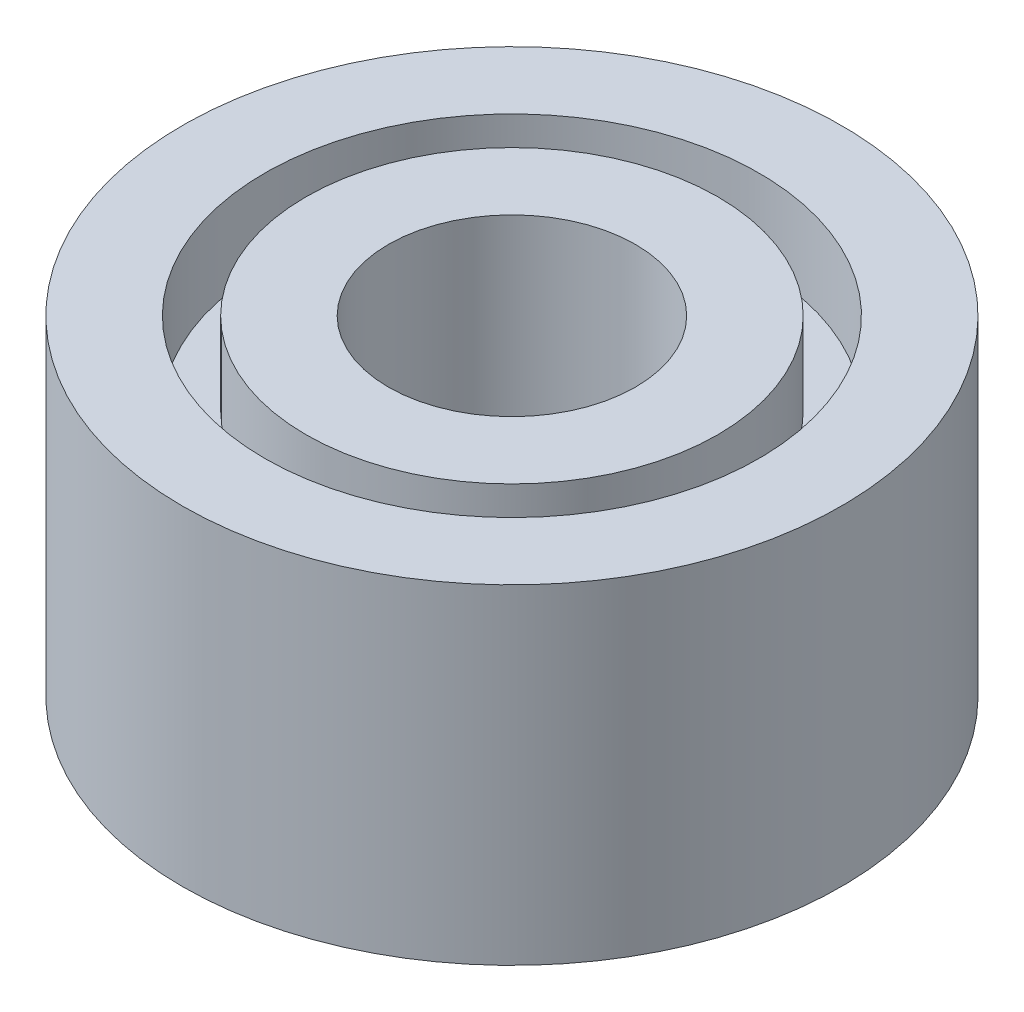
ISO-10303-21;
HEADER;
FILE_DESCRIPTION(('STEP AP214'),'2;1');
FILE_NAME('part.step','',(''),(''),'','','');
FILE_SCHEMA(('AUTOMOTIVE_DESIGN { 1 0 10303 214 1 1 1 1 }'));
ENDSEC;
DATA;
#1=APPLICATION_CONTEXT('core data for automotive mechanical design processes');
#2=APPLICATION_PROTOCOL_DEFINITION('international standard','automotive_design',2000,#1);
#3=PRODUCT_CONTEXT('',#1,'mechanical');
#4=PRODUCT('Part','Part','',(#3));
#5=PRODUCT_RELATED_PRODUCT_CATEGORY('part','',(#4));
#6=PRODUCT_DEFINITION_FORMATION('','',#4);
#7=PRODUCT_DEFINITION_CONTEXT('part definition',#1,'design');
#8=PRODUCT_DEFINITION('design','',#6,#7);
#9=PRODUCT_DEFINITION_SHAPE('','',#8);
#10=(LENGTH_UNIT() NAMED_UNIT(*) SI_UNIT(.MILLI.,.METRE.));
#11=(NAMED_UNIT(*) PLANE_ANGLE_UNIT() SI_UNIT($,.RADIAN.));
#12=(NAMED_UNIT(*) SI_UNIT($,.STERADIAN.) SOLID_ANGLE_UNIT());
#13=UNCERTAINTY_MEASURE_WITH_UNIT(LENGTH_MEASURE(1.E-05),#10,'distance_accuracy_value','');
#14=(GEOMETRIC_REPRESENTATION_CONTEXT(3) GLOBAL_UNCERTAINTY_ASSIGNED_CONTEXT((#13)) GLOBAL_UNIT_ASSIGNED_CONTEXT((#10,
#11,#12)) REPRESENTATION_CONTEXT('',''));
#15=CARTESIAN_POINT('',(0.,0.,0.));
#16=DIRECTION('',(0.,0.,1.));
#17=DIRECTION('',(1.,0.,0.));
#18=AXIS2_PLACEMENT_3D('',#15,#16,#17);
#19=CARTESIAN_POINT('',(0.,0.,0.));
#20=DIRECTION('',(0.,1.,0.));
#21=DIRECTION('',(0.,0.,1.));
#22=AXIS2_PLACEMENT_3D('',#19,#20,#21);
#23=PLANE('',#22);
#24=CARTESIAN_POINT('',(0.,0.,0.));
#25=DIRECTION('',(0.,1.,0.));
#26=DIRECTION('',(0.,0.,1.));
#27=AXIS2_PLACEMENT_3D('',#24,#25,#26);
#28=CIRCLE('',#27,1.5);
#29=CARTESIAN_POINT('',(0.,0.,1.5));
#30=VERTEX_POINT('',#29);
#31=EDGE_CURVE('E46',#30,#30,#28,.T.);
#32=ORIENTED_EDGE('',*,*,#31,.T.);
#33=EDGE_LOOP('',(#32));
#34=FACE_BOUND('',#33,.T.);
#35=CARTESIAN_POINT('',(0.,0.,0.));
#36=DIRECTION('',(0.,1.,0.));
#37=DIRECTION('',(0.,0.,1.));
#38=AXIS2_PLACEMENT_3D('',#35,#36,#37);
#39=CIRCLE('',#38,2.5);
#40=CARTESIAN_POINT('',(0.,0.,2.5));
#41=VERTEX_POINT('',#40);
#42=EDGE_CURVE('E70',#41,#41,#39,.T.);
#43=ORIENTED_EDGE('',*,*,#42,.F.);
#44=EDGE_LOOP('',(#43));
#45=FACE_BOUND('',#44,.T.);
#46=ADVANCED_FACE('F33',(#34,#45),#23,.F.);
#47=CARTESIAN_POINT('',(0.,4.,0.));
#48=DIRECTION('',(0.,1.,0.));
#49=DIRECTION('',(0.,0.,1.));
#50=AXIS2_PLACEMENT_3D('',#47,#48,#49);
#51=PLANE('',#50);
#52=CARTESIAN_POINT('',(0.,4.,0.));
#53=DIRECTION('',(0.,1.,0.));
#54=DIRECTION('',(0.,0.,1.));
#55=AXIS2_PLACEMENT_3D('',#52,#53,#54);
#56=CIRCLE('',#55,1.5);
#57=CARTESIAN_POINT('',(0.,4.,1.5));
#58=VERTEX_POINT('',#57);
#59=EDGE_CURVE('E44',#58,#58,#56,.T.);
#60=ORIENTED_EDGE('',*,*,#59,.F.);
#61=EDGE_LOOP('',(#60));
#62=FACE_BOUND('',#61,.T.);
#63=CARTESIAN_POINT('',(0.,4.,0.));
#64=DIRECTION('',(0.,1.,0.));
#65=DIRECTION('',(0.,0.,1.));
#66=AXIS2_PLACEMENT_3D('',#63,#64,#65);
#67=CIRCLE('',#66,2.5);
#68=CARTESIAN_POINT('',(0.,4.,2.5));
#69=VERTEX_POINT('',#68);
#70=EDGE_CURVE('E58',#69,#69,#67,.T.);
#71=ORIENTED_EDGE('',*,*,#70,.T.);
#72=EDGE_LOOP('',(#71));
#73=FACE_BOUND('',#72,.T.);
#74=ADVANCED_FACE('F86',(#62,#73),#51,.T.);
#75=CARTESIAN_POINT('',(0.,4.,0.));
#76=DIRECTION('',(0.,1.,0.));
#77=DIRECTION('',(0.,0.,1.));
#78=AXIS2_PLACEMENT_3D('',#75,#76,#77);
#79=CIRCLE('',#78,3.);
#80=CARTESIAN_POINT('',(0.,4.,3.));
#81=VERTEX_POINT('',#80);
#82=EDGE_CURVE('E52',#81,#81,#79,.T.);
#83=ORIENTED_EDGE('',*,*,#82,.F.);
#84=EDGE_LOOP('',(#83));
#85=FACE_BOUND('',#84,.T.);
#86=CARTESIAN_POINT('',(0.,4.,0.));
#87=DIRECTION('',(0.,1.,0.));
#88=DIRECTION('',(0.,0.,1.));
#89=AXIS2_PLACEMENT_3D('',#86,#87,#88);
#90=CIRCLE('',#89,4.);
#91=CARTESIAN_POINT('',(0.,4.,4.));
#92=VERTEX_POINT('',#91);
#93=EDGE_CURVE('E10',#92,#92,#90,.T.);
#94=ORIENTED_EDGE('',*,*,#93,.T.);
#95=EDGE_LOOP('',(#94));
#96=FACE_BOUND('',#95,.T.);
#97=ADVANCED_FACE('F92',(#85,#96),#51,.T.);
#98=CARTESIAN_POINT('',(0.,0.,0.));
#99=DIRECTION('',(0.,1.,0.));
#100=DIRECTION('',(0.,0.,1.));
#101=AXIS2_PLACEMENT_3D('',#98,#99,#100);
#102=CIRCLE('',#101,3.);
#103=CARTESIAN_POINT('',(0.,0.,3.));
#104=VERTEX_POINT('',#103);
#105=EDGE_CURVE('E64',#104,#104,#102,.T.);
#106=ORIENTED_EDGE('',*,*,#105,.T.);
#107=EDGE_LOOP('',(#106));
#108=FACE_BOUND('',#107,.T.);
#109=CARTESIAN_POINT('',(0.,0.,0.));
#110=DIRECTION('',(0.,1.,0.));
#111=DIRECTION('',(0.,0.,1.));
#112=AXIS2_PLACEMENT_3D('',#109,#110,#111);
#113=CIRCLE('',#112,4.);
#114=CARTESIAN_POINT('',(0.,0.,4.));
#115=VERTEX_POINT('',#114);
#116=EDGE_CURVE('E37',#115,#115,#113,.T.);
#117=ORIENTED_EDGE('',*,*,#116,.F.);
#118=EDGE_LOOP('',(#117));
#119=FACE_BOUND('',#118,.T.);
#120=ADVANCED_FACE('F88',(#108,#119),#23,.F.);
#121=CARTESIAN_POINT('',(0.,4.,0.));
#122=DIRECTION('',(0.,-1.,0.));
#123=DIRECTION('',(0.,0.,-1.));
#124=AXIS2_PLACEMENT_3D('',#121,#122,#123);
#125=CYLINDRICAL_SURFACE('',#124,4.);
#126=ORIENTED_EDGE('',*,*,#93,.F.);
#127=EDGE_LOOP('',(#126));
#128=FACE_BOUND('',#127,.T.);
#129=ORIENTED_EDGE('',*,*,#116,.T.);
#130=EDGE_LOOP('',(#129));
#131=FACE_BOUND('',#130,.T.);
#132=ADVANCED_FACE('F35',(#128,#131),#125,.T.);
#133=CARTESIAN_POINT('',(0.,4.,0.));
#134=DIRECTION('',(0.,-1.,0.));
#135=DIRECTION('',(0.,0.,-1.));
#136=AXIS2_PLACEMENT_3D('',#133,#134,#135);
#137=CYLINDRICAL_SURFACE('',#136,1.5);
#138=ORIENTED_EDGE('',*,*,#59,.T.);
#139=EDGE_LOOP('',(#138));
#140=FACE_BOUND('',#139,.T.);
#141=ORIENTED_EDGE('',*,*,#31,.F.);
#142=EDGE_LOOP('',(#141));
#143=FACE_BOUND('',#142,.T.);
#144=ADVANCED_FACE('F101',(#140,#143),#137,.F.);
#145=CARTESIAN_POINT('',(0.,3.,0.));
#146=DIRECTION('',(0.,1.,0.));
#147=DIRECTION('',(0.,0.,1.));
#148=AXIS2_PLACEMENT_3D('',#145,#146,#147);
#149=CYLINDRICAL_SURFACE('',#148,3.);
#150=CARTESIAN_POINT('',(0.,3.,0.));
#151=DIRECTION('',(0.,1.,0.));
#152=DIRECTION('',(0.,0.,1.));
#153=AXIS2_PLACEMENT_3D('',#150,#151,#152);
#154=CIRCLE('',#153,3.);
#155=CARTESIAN_POINT('',(0.,3.,3.));
#156=VERTEX_POINT('',#155);
#157=EDGE_CURVE('E49',#156,#156,#154,.T.);
#158=ORIENTED_EDGE('',*,*,#157,.F.);
#159=EDGE_LOOP('',(#158));
#160=FACE_BOUND('',#159,.T.);
#161=ORIENTED_EDGE('',*,*,#82,.T.);
#162=EDGE_LOOP('',(#161));
#163=FACE_BOUND('',#162,.T.);
#164=ADVANCED_FACE('F125',(#160,#163),#149,.F.);
#165=CARTESIAN_POINT('',(0.,3.,0.));
#166=DIRECTION('',(0.,1.,0.));
#167=DIRECTION('',(0.,0.,1.));
#168=AXIS2_PLACEMENT_3D('',#165,#166,#167);
#169=PLANE('',#168);
#170=CARTESIAN_POINT('',(0.,3.,0.));
#171=DIRECTION('',(0.,1.,0.));
#172=DIRECTION('',(0.,0.,1.));
#173=AXIS2_PLACEMENT_3D('',#170,#171,#172);
#174=CIRCLE('',#173,2.5);
#175=CARTESIAN_POINT('',(0.,3.,2.5));
#176=VERTEX_POINT('',#175);
#177=EDGE_CURVE('E55',#176,#176,#174,.T.);
#178=ORIENTED_EDGE('',*,*,#177,.F.);
#179=EDGE_LOOP('',(#178));
#180=FACE_BOUND('',#179,.T.);
#181=ORIENTED_EDGE('',*,*,#157,.T.);
#182=EDGE_LOOP('',(#181));
#183=FACE_BOUND('',#182,.T.);
#184=ADVANCED_FACE('F121',(#180,#183),#169,.T.);
#185=CARTESIAN_POINT('',(0.,3.,0.));
#186=DIRECTION('',(0.,1.,0.));
#187=DIRECTION('',(0.,0.,1.));
#188=AXIS2_PLACEMENT_3D('',#185,#186,#187);
#189=CYLINDRICAL_SURFACE('',#188,2.5);
#190=ORIENTED_EDGE('',*,*,#177,.T.);
#191=EDGE_LOOP('',(#190));
#192=FACE_BOUND('',#191,.T.);
#193=ORIENTED_EDGE('',*,*,#70,.F.);
#194=EDGE_LOOP('',(#193));
#195=FACE_BOUND('',#194,.T.);
#196=ADVANCED_FACE('F115',(#192,#195),#189,.T.);
#197=CARTESIAN_POINT('',(0.,1.,0.));
#198=DIRECTION('',(0.,-1.,0.));
#199=DIRECTION('',(0.,0.,1.));
#200=AXIS2_PLACEMENT_3D('',#197,#198,#199);
#201=PLANE('',#200);
#202=CARTESIAN_POINT('',(0.,1.,0.));
#203=DIRECTION('',(0.,1.,0.));
#204=DIRECTION('',(0.,0.,1.));
#205=AXIS2_PLACEMENT_3D('',#202,#203,#204);
#206=CIRCLE('',#205,3.);
#207=CARTESIAN_POINT('',(0.,1.,3.));
#208=VERTEX_POINT('',#207);
#209=EDGE_CURVE('E61',#208,#208,#206,.T.);
#210=ORIENTED_EDGE('',*,*,#209,.F.);
#211=EDGE_LOOP('',(#210));
#212=FACE_BOUND('',#211,.T.);
#213=CARTESIAN_POINT('',(0.,1.,0.));
#214=DIRECTION('',(0.,1.,0.));
#215=DIRECTION('',(0.,0.,1.));
#216=AXIS2_PLACEMENT_3D('',#213,#214,#215);
#217=CIRCLE('',#216,2.5);
#218=CARTESIAN_POINT('',(0.,1.,2.5));
#219=VERTEX_POINT('',#218);
#220=EDGE_CURVE('E67',#219,#219,#217,.T.);
#221=ORIENTED_EDGE('',*,*,#220,.T.);
#222=EDGE_LOOP('',(#221));
#223=FACE_BOUND('',#222,.T.);
#224=ADVANCED_FACE('F76',(#212,#223),#201,.T.);
#225=CARTESIAN_POINT('',(0.,1.,0.));
#226=DIRECTION('',(0.,-1.,0.));
#227=DIRECTION('',(0.,0.,-1.));
#228=AXIS2_PLACEMENT_3D('',#225,#226,#227);
#229=CYLINDRICAL_SURFACE('',#228,3.);
#230=ORIENTED_EDGE('',*,*,#209,.T.);
#231=EDGE_LOOP('',(#230));
#232=FACE_BOUND('',#231,.T.);
#233=ORIENTED_EDGE('',*,*,#105,.F.);
#234=EDGE_LOOP('',(#233));
#235=FACE_BOUND('',#234,.T.);
#236=ADVANCED_FACE('F81',(#232,#235),#229,.F.);
#237=CARTESIAN_POINT('',(0.,1.,0.));
#238=DIRECTION('',(0.,-1.,0.));
#239=DIRECTION('',(0.,0.,-1.));
#240=AXIS2_PLACEMENT_3D('',#237,#238,#239);
#241=CYLINDRICAL_SURFACE('',#240,2.5);
#242=ORIENTED_EDGE('',*,*,#220,.F.);
#243=EDGE_LOOP('',(#242));
#244=FACE_BOUND('',#243,.T.);
#245=ORIENTED_EDGE('',*,*,#42,.T.);
#246=EDGE_LOOP('',(#245));
#247=FACE_BOUND('',#246,.T.);
#248=ADVANCED_FACE('F78',(#244,#247),#241,.T.);
#249=CLOSED_SHELL('',(#46,#74,#97,#120,#132,#144,#164,#184,#196,#224,#236,#248));
#250=MANIFOLD_SOLID_BREP('B2',#249);
#251=ADVANCED_BREP_SHAPE_REPRESENTATION('',(#18,#250),#14);
#252=SHAPE_DEFINITION_REPRESENTATION(#9,#251);
ENDSEC;
END-ISO-10303-21;
